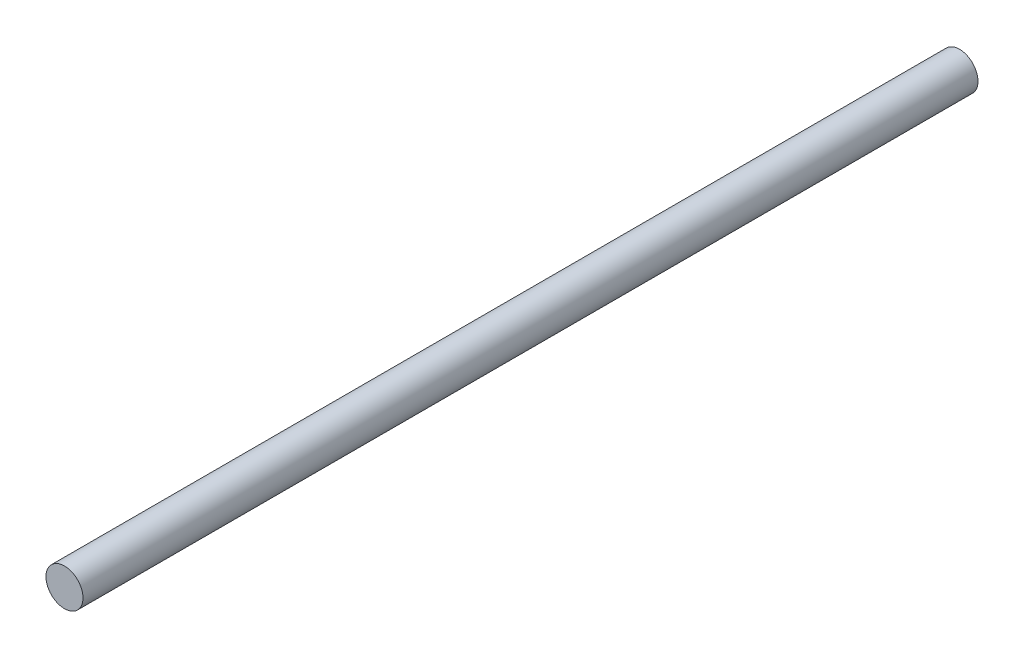
ISO-10303-21;
HEADER;
FILE_DESCRIPTION(('STEP AP214'),'2;1');
FILE_NAME('part.step','',(''),(''),'','','');
FILE_SCHEMA(('AUTOMOTIVE_DESIGN { 1 0 10303 214 1 1 1 1 }'));
ENDSEC;
DATA;
#1=APPLICATION_CONTEXT('core data for automotive mechanical design processes');
#2=APPLICATION_PROTOCOL_DEFINITION('international standard','automotive_design',2000,#1);
#3=PRODUCT_CONTEXT('',#1,'mechanical');
#4=PRODUCT('Part','Part','',(#3));
#5=PRODUCT_RELATED_PRODUCT_CATEGORY('part','',(#4));
#6=PRODUCT_DEFINITION_FORMATION('','',#4);
#7=PRODUCT_DEFINITION_CONTEXT('part definition',#1,'design');
#8=PRODUCT_DEFINITION('design','',#6,#7);
#9=PRODUCT_DEFINITION_SHAPE('','',#8);
#10=(LENGTH_UNIT() NAMED_UNIT(*) SI_UNIT(.MILLI.,.METRE.));
#11=(NAMED_UNIT(*) PLANE_ANGLE_UNIT() SI_UNIT($,.RADIAN.));
#12=(NAMED_UNIT(*) SI_UNIT($,.STERADIAN.) SOLID_ANGLE_UNIT());
#13=UNCERTAINTY_MEASURE_WITH_UNIT(LENGTH_MEASURE(1.E-05),#10,'distance_accuracy_value','');
#14=(GEOMETRIC_REPRESENTATION_CONTEXT(3) GLOBAL_UNCERTAINTY_ASSIGNED_CONTEXT((#13)) GLOBAL_UNIT_ASSIGNED_CONTEXT((#10,
#11,#12)) REPRESENTATION_CONTEXT('',''));
#15=CARTESIAN_POINT('',(0.,0.,0.));
#16=DIRECTION('',(0.,0.,1.));
#17=DIRECTION('',(1.,0.,0.));
#18=AXIS2_PLACEMENT_3D('',#15,#16,#17);
#19=CARTESIAN_POINT('',(0.,0.,290.));
#20=DIRECTION('',(0.,0.,-1.));
#21=DIRECTION('',(-1.,0.,0.));
#22=AXIS2_PLACEMENT_3D('',#19,#20,#21);
#23=CYLINDRICAL_SURFACE('',#22,6.);
#24=CARTESIAN_POINT('',(0.,0.,290.));
#25=DIRECTION('',(0.,0.,1.));
#26=DIRECTION('',(1.,0.,0.));
#27=AXIS2_PLACEMENT_3D('',#24,#25,#26);
#28=CIRCLE('',#27,6.);
#29=CARTESIAN_POINT('',(6.,0.,290.));
#30=VERTEX_POINT('',#29);
#31=EDGE_CURVE('E10',#30,#30,#28,.T.);
#32=ORIENTED_EDGE('',*,*,#31,.F.);
#33=EDGE_LOOP('',(#32));
#34=FACE_BOUND('',#33,.T.);
#35=CARTESIAN_POINT('',(0.,0.,0.));
#36=DIRECTION('',(0.,0.,1.));
#37=DIRECTION('',(1.,0.,0.));
#38=AXIS2_PLACEMENT_3D('',#35,#36,#37);
#39=CIRCLE('',#38,6.);
#40=CARTESIAN_POINT('',(6.,0.,0.));
#41=VERTEX_POINT('',#40);
#42=EDGE_CURVE('E38',#41,#41,#39,.T.);
#43=ORIENTED_EDGE('',*,*,#42,.T.);
#44=EDGE_LOOP('',(#43));
#45=FACE_BOUND('',#44,.T.);
#46=ADVANCED_FACE('F35',(#34,#45),#23,.T.);
#47=CARTESIAN_POINT('',(0.,0.,290.));
#48=DIRECTION('',(0.,0.,1.));
#49=DIRECTION('',(1.,0.,0.));
#50=AXIS2_PLACEMENT_3D('',#47,#48,#49);
#51=PLANE('',#50);
#52=ORIENTED_EDGE('',*,*,#31,.T.);
#53=EDGE_LOOP('',(#52));
#54=FACE_BOUND('',#53,.T.);
#55=ADVANCED_FACE('F50',(#54),#51,.T.);
#56=CARTESIAN_POINT('',(0.,0.,0.));
#57=DIRECTION('',(0.,0.,1.));
#58=DIRECTION('',(1.,0.,0.));
#59=AXIS2_PLACEMENT_3D('',#56,#57,#58);
#60=PLANE('',#59);
#61=ORIENTED_EDGE('',*,*,#42,.F.);
#62=EDGE_LOOP('',(#61));
#63=FACE_BOUND('',#62,.T.);
#64=ADVANCED_FACE('F48',(#63),#60,.F.);
#65=CLOSED_SHELL('',(#46,#55,#64));
#66=MANIFOLD_SOLID_BREP('B2',#65);
#67=ADVANCED_BREP_SHAPE_REPRESENTATION('',(#18,#66),#14);
#68=SHAPE_DEFINITION_REPRESENTATION(#9,#67);
ENDSEC;
END-ISO-10303-21;
